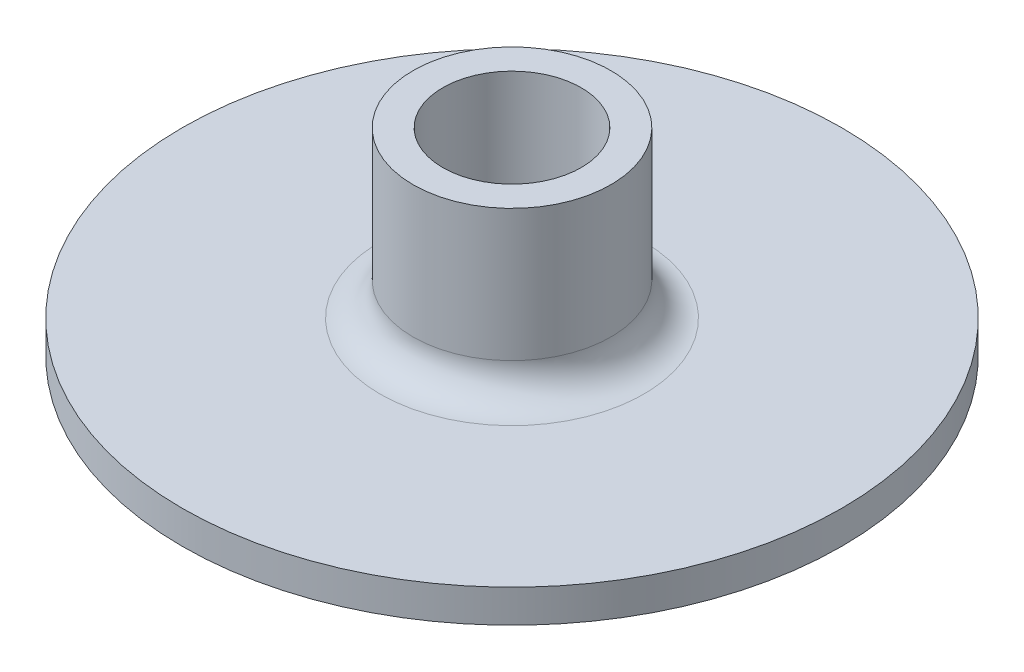
ISO-10303-21;
HEADER;
FILE_DESCRIPTION(('STEP AP214'),'2;1');
FILE_NAME('part.step','',(''),(''),'','','');
FILE_SCHEMA(('AUTOMOTIVE_DESIGN { 1 0 10303 214 1 1 1 1 }'));
ENDSEC;
DATA;
#1=APPLICATION_CONTEXT('core data for automotive mechanical design processes');
#2=APPLICATION_PROTOCOL_DEFINITION('international standard','automotive_design',2000,#1);
#3=PRODUCT_CONTEXT('',#1,'mechanical');
#4=PRODUCT('Part','Part','',(#3));
#5=PRODUCT_RELATED_PRODUCT_CATEGORY('part','',(#4));
#6=PRODUCT_DEFINITION_FORMATION('','',#4);
#7=PRODUCT_DEFINITION_CONTEXT('part definition',#1,'design');
#8=PRODUCT_DEFINITION('design','',#6,#7);
#9=PRODUCT_DEFINITION_SHAPE('','',#8);
#10=(LENGTH_UNIT() NAMED_UNIT(*) SI_UNIT(.MILLI.,.METRE.));
#11=(NAMED_UNIT(*) PLANE_ANGLE_UNIT() SI_UNIT($,.RADIAN.));
#12=(NAMED_UNIT(*) SI_UNIT($,.STERADIAN.) SOLID_ANGLE_UNIT());
#13=UNCERTAINTY_MEASURE_WITH_UNIT(LENGTH_MEASURE(1.E-05),#10,'distance_accuracy_value','');
#14=(GEOMETRIC_REPRESENTATION_CONTEXT(3) GLOBAL_UNCERTAINTY_ASSIGNED_CONTEXT((#13)) GLOBAL_UNIT_ASSIGNED_CONTEXT((#10,
#11,#12)) REPRESENTATION_CONTEXT('',''));
#15=CARTESIAN_POINT('',(0.,0.,0.));
#16=DIRECTION('',(0.,0.,1.));
#17=DIRECTION('',(1.,0.,0.));
#18=AXIS2_PLACEMENT_3D('',#15,#16,#17);
#19=CARTESIAN_POINT('',(0.,-9.,0.));
#20=DIRECTION('',(0.,1.,0.));
#21=DIRECTION('',(0.,0.,1.));
#22=AXIS2_PLACEMENT_3D('',#19,#20,#21);
#23=CYLINDRICAL_SURFACE('',#22,19.);
#24=CARTESIAN_POINT('',(0.,0.,0.));
#25=DIRECTION('',(0.,-1.,0.));
#26=DIRECTION('',(0.,0.,-1.));
#27=AXIS2_PLACEMENT_3D('',#24,#25,#26);
#28=CIRCLE('',#27,19.);
#29=CARTESIAN_POINT('',(0.,0.,-19.));
#30=VERTEX_POINT('',#29);
#31=EDGE_CURVE('E69',#30,#30,#28,.T.);
#32=ORIENTED_EDGE('',*,*,#31,.F.);
#33=EDGE_LOOP('',(#32));
#34=FACE_BOUND('',#33,.T.);
#35=CARTESIAN_POINT('',(0.,-6.,0.));
#36=DIRECTION('',(0.,-1.,0.));
#37=DIRECTION('',(0.,0.,-1.));
#38=AXIS2_PLACEMENT_3D('',#35,#36,#37);
#39=CIRCLE('',#38,19.);
#40=CARTESIAN_POINT('',(0.,-6.,-19.));
#41=VERTEX_POINT('',#40);
#42=EDGE_CURVE('E47',#41,#41,#39,.T.);
#43=ORIENTED_EDGE('',*,*,#42,.T.);
#44=EDGE_LOOP('',(#43));
#45=FACE_BOUND('',#44,.T.);
#46=ADVANCED_FACE('F29',(#34,#45),#23,.F.);
#47=CARTESIAN_POINT('',(0.,0.,0.));
#48=DIRECTION('',(0.,1.,0.));
#49=DIRECTION('',(0.,0.,1.));
#50=AXIS2_PLACEMENT_3D('',#47,#48,#49);
#51=PLANE('',#50);
#52=CARTESIAN_POINT('',(0.,0.,0.));
#53=DIRECTION('',(0.,1.,0.));
#54=DIRECTION('',(0.,0.,1.));
#55=AXIS2_PLACEMENT_3D('',#52,#53,#54);
#56=CIRCLE('',#55,50.);
#57=CARTESIAN_POINT('',(0.,0.,50.));
#58=VERTEX_POINT('',#57);
#59=EDGE_CURVE('E44',#58,#58,#56,.T.);
#60=ORIENTED_EDGE('',*,*,#59,.F.);
#61=EDGE_LOOP('',(#60));
#62=FACE_BOUND('',#61,.T.);
#63=CARTESIAN_POINT('',(0.,0.,0.));
#64=DIRECTION('',(0.,1.,0.));
#65=DIRECTION('',(0.,0.,1.));
#66=AXIS2_PLACEMENT_3D('',#63,#64,#65);
#67=CIRCLE('',#66,28.);
#68=CARTESIAN_POINT('',(0.,0.,28.));
#69=VERTEX_POINT('',#68);
#70=EDGE_CURVE('E40',#69,#69,#67,.F.);
#71=ORIENTED_EDGE('',*,*,#70,.F.);
#72=EDGE_LOOP('',(#71));
#73=FACE_BOUND('',#72,.T.);
#74=ADVANCED_FACE('F137',(#62,#73),#51,.F.);
#75=ORIENTED_EDGE('',*,*,#31,.T.);
#76=EDGE_LOOP('',(#75));
#77=FACE_BOUND('',#76,.T.);
#78=CARTESIAN_POINT('',(0.,0.,0.));
#79=DIRECTION('',(0.,1.,0.));
#80=DIRECTION('',(0.,0.,1.));
#81=AXIS2_PLACEMENT_3D('',#78,#79,#80);
#82=CIRCLE('',#81,10.5);
#83=CARTESIAN_POINT('',(0.,0.,10.5));
#84=VERTEX_POINT('',#83);
#85=EDGE_CURVE('E55',#84,#84,#82,.T.);
#86=ORIENTED_EDGE('',*,*,#85,.T.);
#87=EDGE_LOOP('',(#86));
#88=FACE_BOUND('',#87,.T.);
#89=ADVANCED_FACE('F143',(#77,#88),#51,.F.);
#90=CARTESIAN_POINT('',(0.,30.,0.));
#91=DIRECTION('',(0.,1.,0.));
#92=DIRECTION('',(0.,0.,1.));
#93=AXIS2_PLACEMENT_3D('',#90,#91,#92);
#94=PLANE('',#93);
#95=CARTESIAN_POINT('',(0.,30.,0.));
#96=DIRECTION('',(0.,1.,0.));
#97=DIRECTION('',(0.,0.,1.));
#98=AXIS2_PLACEMENT_3D('',#95,#96,#97);
#99=CIRCLE('',#98,10.5);
#100=CARTESIAN_POINT('',(0.,30.,10.5));
#101=VERTEX_POINT('',#100);
#102=EDGE_CURVE('E59',#101,#101,#99,.T.);
#103=ORIENTED_EDGE('',*,*,#102,.F.);
#104=EDGE_LOOP('',(#103));
#105=FACE_BOUND('',#104,.T.);
#106=CARTESIAN_POINT('',(0.,30.,0.));
#107=DIRECTION('',(0.,1.,0.));
#108=DIRECTION('',(0.,0.,1.));
#109=AXIS2_PLACEMENT_3D('',#106,#107,#108);
#110=CIRCLE('',#109,15.);
#111=CARTESIAN_POINT('',(0.,30.,15.));
#112=VERTEX_POINT('',#111);
#113=EDGE_CURVE('E56',#112,#112,#110,.T.);
#114=ORIENTED_EDGE('',*,*,#113,.T.);
#115=EDGE_LOOP('',(#114));
#116=FACE_BOUND('',#115,.T.);
#117=ADVANCED_FACE('F172',(#105,#116),#94,.T.);
#118=CARTESIAN_POINT('',(0.,30.,0.));
#119=DIRECTION('',(0.,-1.,0.));
#120=DIRECTION('',(0.,0.,-1.));
#121=AXIS2_PLACEMENT_3D('',#118,#119,#120);
#122=CYLINDRICAL_SURFACE('',#121,50.);
#123=ORIENTED_EDGE('',*,*,#59,.T.);
#124=EDGE_LOOP('',(#123));
#125=FACE_BOUND('',#124,.T.);
#126=CARTESIAN_POINT('',(0.,5.,0.));
#127=DIRECTION('',(0.,1.,0.));
#128=DIRECTION('',(0.,0.,1.));
#129=AXIS2_PLACEMENT_3D('',#126,#127,#128);
#130=CIRCLE('',#129,50.);
#131=CARTESIAN_POINT('',(0.,5.,50.));
#132=VERTEX_POINT('',#131);
#133=EDGE_CURVE('E52',#132,#132,#130,.T.);
#134=ORIENTED_EDGE('',*,*,#133,.F.);
#135=EDGE_LOOP('',(#134));
#136=FACE_BOUND('',#135,.T.);
#137=ADVANCED_FACE('F170',(#125,#136),#122,.T.);
#138=CARTESIAN_POINT('',(0.,30.,0.));
#139=DIRECTION('',(0.,-1.,0.));
#140=DIRECTION('',(0.,0.,-1.));
#141=AXIS2_PLACEMENT_3D('',#138,#139,#140);
#142=CYLINDRICAL_SURFACE('',#141,10.5);
#143=ORIENTED_EDGE('',*,*,#102,.T.);
#144=EDGE_LOOP('',(#143));
#145=FACE_BOUND('',#144,.T.);
#146=ORIENTED_EDGE('',*,*,#85,.F.);
#147=EDGE_LOOP('',(#146));
#148=FACE_BOUND('',#147,.T.);
#149=ADVANCED_FACE('F168',(#145,#148),#142,.F.);
#150=CARTESIAN_POINT('',(0.,5.,0.));
#151=DIRECTION('',(0.,1.,0.));
#152=DIRECTION('',(0.,0.,1.));
#153=AXIS2_PLACEMENT_3D('',#150,#151,#152);
#154=PLANE('',#153);
#155=CARTESIAN_POINT('',(0.,5.,0.));
#156=DIRECTION('',(0.,1.,0.));
#157=DIRECTION('',(0.,0.,1.));
#158=AXIS2_PLACEMENT_3D('',#155,#156,#157);
#159=CIRCLE('',#158,20.);
#160=CARTESIAN_POINT('',(0.,5.,20.));
#161=VERTEX_POINT('',#160);
#162=EDGE_CURVE('E10',#161,#161,#159,.F.);
#163=ORIENTED_EDGE('',*,*,#162,.T.);
#164=EDGE_LOOP('',(#163));
#165=FACE_BOUND('',#164,.T.);
#166=ORIENTED_EDGE('',*,*,#133,.T.);
#167=EDGE_LOOP('',(#166));
#168=FACE_BOUND('',#167,.T.);
#169=ADVANCED_FACE('F165',(#165,#168),#154,.T.);
#170=CARTESIAN_POINT('',(0.,5.,0.));
#171=DIRECTION('',(0.,1.,0.));
#172=DIRECTION('',(0.,0.,1.));
#173=AXIS2_PLACEMENT_3D('',#170,#171,#172);
#174=CYLINDRICAL_SURFACE('',#173,15.);
#175=CARTESIAN_POINT('',(0.,10.,0.));
#176=DIRECTION('',(0.,1.,0.));
#177=DIRECTION('',(0.,0.,1.));
#178=AXIS2_PLACEMENT_3D('',#175,#176,#177);
#179=CIRCLE('',#178,15.);
#180=CARTESIAN_POINT('',(0.,10.,15.));
#181=VERTEX_POINT('',#180);
#182=EDGE_CURVE('E36',#181,#181,#179,.T.);
#183=ORIENTED_EDGE('',*,*,#182,.T.);
#184=EDGE_LOOP('',(#183));
#185=FACE_BOUND('',#184,.T.);
#186=ORIENTED_EDGE('',*,*,#113,.F.);
#187=EDGE_LOOP('',(#186));
#188=FACE_BOUND('',#187,.T.);
#189=ADVANCED_FACE('F114',(#185,#188),#174,.T.);
#190=CARTESIAN_POINT('',(0.,-9.,0.));
#191=DIRECTION('',(0.,-1.,0.));
#192=DIRECTION('',(0.,0.,-1.));
#193=AXIS2_PLACEMENT_3D('',#190,#191,#192);
#194=PLANE('',#193);
#195=CARTESIAN_POINT('',(0.,-9.,0.));
#196=DIRECTION('',(0.,-1.,0.));
#197=DIRECTION('',(0.,0.,-1.));
#198=AXIS2_PLACEMENT_3D('',#195,#196,#197);
#199=CIRCLE('',#198,22.1);
#200=CARTESIAN_POINT('',(0.,-9.,-22.1));
#201=VERTEX_POINT('',#200);
#202=EDGE_CURVE('E95',#201,#201,#199,.T.);
#203=ORIENTED_EDGE('',*,*,#202,.F.);
#204=EDGE_LOOP('',(#203));
#205=FACE_BOUND('',#204,.T.);
#206=CARTESIAN_POINT('',(-1.74574168055469E-13,-9.,-25.));
#207=DIRECTION('',(0.,-1.,0.));
#208=DIRECTION('',(0.,0.,-1.));
#209=AXIS2_PLACEMENT_3D('',#206,#207,#208);
#210=CIRCLE('',#209,1.5);
#211=CARTESIAN_POINT('',(-1.74574168055469E-13,-9.,-26.5));
#212=VERTEX_POINT('',#211);
#213=EDGE_CURVE('E82',#212,#212,#210,.T.);
#214=ORIENTED_EDGE('',*,*,#213,.F.);
#215=EDGE_LOOP('',(#214));
#216=FACE_BOUND('',#215,.T.);
#217=CARTESIAN_POINT('',(0.,-9.,25.));
#218=DIRECTION('',(0.,-1.,0.));
#219=DIRECTION('',(0.,0.,-1.));
#220=AXIS2_PLACEMENT_3D('',#217,#218,#219);
#221=CIRCLE('',#220,1.5);
#222=CARTESIAN_POINT('',(0.,-9.,23.5));
#223=VERTEX_POINT('',#222);
#224=EDGE_CURVE('E72',#223,#223,#221,.T.);
#225=ORIENTED_EDGE('',*,*,#224,.F.);
#226=EDGE_LOOP('',(#225));
#227=FACE_BOUND('',#226,.T.);
#228=CARTESIAN_POINT('',(0.,-9.,0.));
#229=DIRECTION('',(0.,-1.,0.));
#230=DIRECTION('',(0.,0.,-1.));
#231=AXIS2_PLACEMENT_3D('',#228,#229,#230);
#232=CIRCLE('',#231,28.);
#233=CARTESIAN_POINT('',(0.,-9.,-28.));
#234=VERTEX_POINT('',#233);
#235=EDGE_CURVE('E66',#234,#234,#232,.T.);
#236=ORIENTED_EDGE('',*,*,#235,.T.);
#237=EDGE_LOOP('',(#236));
#238=FACE_BOUND('',#237,.T.);
#239=CARTESIAN_POINT('',(25.,-9.,0.));
#240=DIRECTION('',(0.,-1.,0.));
#241=DIRECTION('',(0.,0.,-1.));
#242=AXIS2_PLACEMENT_3D('',#239,#240,#241);
#243=CIRCLE('',#242,1.5);
#244=CARTESIAN_POINT('',(25.,-9.,-1.50000000000009));
#245=VERTEX_POINT('',#244);
#246=EDGE_CURVE('E76',#245,#245,#243,.T.);
#247=ORIENTED_EDGE('',*,*,#246,.F.);
#248=EDGE_LOOP('',(#247));
#249=FACE_BOUND('',#248,.T.);
#250=CARTESIAN_POINT('',(-25.,-9.,2.61861252083204E-13));
#251=DIRECTION('',(0.,-1.,0.));
#252=DIRECTION('',(0.,0.,-1.));
#253=AXIS2_PLACEMENT_3D('',#250,#251,#252);
#254=CIRCLE('',#253,1.5);
#255=CARTESIAN_POINT('',(-25.,-9.,-1.49999999999974));
#256=VERTEX_POINT('',#255);
#257=EDGE_CURVE('E88',#256,#256,#254,.T.);
#258=ORIENTED_EDGE('',*,*,#257,.F.);
#259=EDGE_LOOP('',(#258));
#260=FACE_BOUND('',#259,.T.);
#261=ADVANCED_FACE('F110',(#205,#216,#227,#238,#249,#260),#194,.T.);
#262=CARTESIAN_POINT('',(0.,-9.,0.));
#263=DIRECTION('',(0.,1.,0.));
#264=DIRECTION('',(0.,0.,1.));
#265=AXIS2_PLACEMENT_3D('',#262,#263,#264);
#266=CYLINDRICAL_SURFACE('',#265,28.);
#267=ORIENTED_EDGE('',*,*,#235,.F.);
#268=EDGE_LOOP('',(#267));
#269=FACE_BOUND('',#268,.T.);
#270=ORIENTED_EDGE('',*,*,#70,.T.);
#271=EDGE_LOOP('',(#270));
#272=FACE_BOUND('',#271,.T.);
#273=ADVANCED_FACE('F113',(#269,#272),#266,.T.);
#274=CARTESIAN_POINT('',(0.,-9.,25.));
#275=DIRECTION('',(0.,1.,0.));
#276=DIRECTION('',(0.,0.,1.));
#277=AXIS2_PLACEMENT_3D('',#274,#275,#276);
#278=CYLINDRICAL_SURFACE('',#277,1.5);
#279=ORIENTED_EDGE('',*,*,#224,.T.);
#280=EDGE_LOOP('',(#279));
#281=FACE_BOUND('',#280,.T.);
#282=CARTESIAN_POINT('',(0.,0.,25.));
#283=DIRECTION('',(0.,-1.,0.));
#284=DIRECTION('',(0.,0.,-1.));
#285=AXIS2_PLACEMENT_3D('',#282,#283,#284);
#286=CIRCLE('',#285,1.5);
#287=CARTESIAN_POINT('',(0.,0.,23.5));
#288=VERTEX_POINT('',#287);
#289=EDGE_CURVE('E73',#288,#288,#286,.T.);
#290=ORIENTED_EDGE('',*,*,#289,.F.);
#291=EDGE_LOOP('',(#290));
#292=FACE_BOUND('',#291,.T.);
#293=ADVANCED_FACE('F157',(#281,#292),#278,.F.);
#294=CARTESIAN_POINT('',(25.,-9.,0.));
#295=DIRECTION('',(0.,1.,0.));
#296=DIRECTION('',(0.,0.,1.));
#297=AXIS2_PLACEMENT_3D('',#294,#295,#296);
#298=CYLINDRICAL_SURFACE('',#297,1.5);
#299=ORIENTED_EDGE('',*,*,#246,.T.);
#300=EDGE_LOOP('',(#299));
#301=FACE_BOUND('',#300,.T.);
#302=CARTESIAN_POINT('',(25.,0.,0.));
#303=DIRECTION('',(0.,-1.,0.));
#304=DIRECTION('',(0.,0.,-1.));
#305=AXIS2_PLACEMENT_3D('',#302,#303,#304);
#306=CIRCLE('',#305,1.5);
#307=CARTESIAN_POINT('',(25.,0.,-1.50000000000009));
#308=VERTEX_POINT('',#307);
#309=EDGE_CURVE('E79',#308,#308,#306,.T.);
#310=ORIENTED_EDGE('',*,*,#309,.F.);
#311=EDGE_LOOP('',(#310));
#312=FACE_BOUND('',#311,.T.);
#313=ADVANCED_FACE('F238',(#301,#312),#298,.F.);
#314=CARTESIAN_POINT('',(-1.74574168055469E-13,-9.,-25.));
#315=DIRECTION('',(0.,1.,0.));
#316=DIRECTION('',(0.,0.,1.));
#317=AXIS2_PLACEMENT_3D('',#314,#315,#316);
#318=CYLINDRICAL_SURFACE('',#317,1.5);
#319=ORIENTED_EDGE('',*,*,#213,.T.);
#320=EDGE_LOOP('',(#319));
#321=FACE_BOUND('',#320,.T.);
#322=CARTESIAN_POINT('',(-1.74574168055469E-13,0.,-25.));
#323=DIRECTION('',(0.,-1.,0.));
#324=DIRECTION('',(0.,0.,-1.));
#325=AXIS2_PLACEMENT_3D('',#322,#323,#324);
#326=CIRCLE('',#325,1.5);
#327=CARTESIAN_POINT('',(-1.74574168055469E-13,0.,-26.5));
#328=VERTEX_POINT('',#327);
#329=EDGE_CURVE('E85',#328,#328,#326,.T.);
#330=ORIENTED_EDGE('',*,*,#329,.F.);
#331=EDGE_LOOP('',(#330));
#332=FACE_BOUND('',#331,.T.);
#333=ADVANCED_FACE('F130',(#321,#332),#318,.F.);
#334=CARTESIAN_POINT('',(-25.,-9.,2.61861252083204E-13));
#335=DIRECTION('',(0.,1.,0.));
#336=DIRECTION('',(0.,0.,1.));
#337=AXIS2_PLACEMENT_3D('',#334,#335,#336);
#338=CYLINDRICAL_SURFACE('',#337,1.5);
#339=ORIENTED_EDGE('',*,*,#257,.T.);
#340=EDGE_LOOP('',(#339));
#341=FACE_BOUND('',#340,.T.);
#342=CARTESIAN_POINT('',(-25.,0.,2.61861252083204E-13));
#343=DIRECTION('',(0.,-1.,0.));
#344=DIRECTION('',(0.,0.,-1.));
#345=AXIS2_PLACEMENT_3D('',#342,#343,#344);
#346=CIRCLE('',#345,1.5);
#347=CARTESIAN_POINT('',(-25.,0.,-1.49999999999974));
#348=VERTEX_POINT('',#347);
#349=EDGE_CURVE('E49',#348,#348,#346,.T.);
#350=ORIENTED_EDGE('',*,*,#349,.F.);
#351=EDGE_LOOP('',(#350));
#352=FACE_BOUND('',#351,.T.);
#353=ADVANCED_FACE('F126',(#341,#352),#338,.F.);
#354=ORIENTED_EDGE('',*,*,#329,.T.);
#355=EDGE_LOOP('',(#354));
#356=FACE_BOUND('',#355,.T.);
#357=ADVANCED_FACE('F129',(#356),#51,.F.);
#358=ORIENTED_EDGE('',*,*,#309,.T.);
#359=EDGE_LOOP('',(#358));
#360=FACE_BOUND('',#359,.T.);
#361=ADVANCED_FACE('F141',(#360),#51,.F.);
#362=ORIENTED_EDGE('',*,*,#289,.T.);
#363=EDGE_LOOP('',(#362));
#364=FACE_BOUND('',#363,.T.);
#365=ADVANCED_FACE('F135',(#364),#51,.F.);
#366=ORIENTED_EDGE('',*,*,#349,.T.);
#367=EDGE_LOOP('',(#366));
#368=FACE_BOUND('',#367,.T.);
#369=ADVANCED_FACE('F106',(#368),#51,.F.);
#370=CARTESIAN_POINT('',(0.,-6.,0.));
#371=DIRECTION('',(0.,-1.,0.));
#372=DIRECTION('',(0.,0.,-1.));
#373=AXIS2_PLACEMENT_3D('',#370,#371,#372);
#374=CYLINDRICAL_SURFACE('',#373,22.1);
#375=CARTESIAN_POINT('',(0.,-6.,0.));
#376=DIRECTION('',(0.,-1.,0.));
#377=DIRECTION('',(0.,0.,-1.));
#378=AXIS2_PLACEMENT_3D('',#375,#376,#377);
#379=CIRCLE('',#378,22.1);
#380=CARTESIAN_POINT('',(0.,-6.,-22.1));
#381=VERTEX_POINT('',#380);
#382=EDGE_CURVE('E50',#381,#381,#379,.T.);
#383=ORIENTED_EDGE('',*,*,#382,.F.);
#384=EDGE_LOOP('',(#383));
#385=FACE_BOUND('',#384,.T.);
#386=ORIENTED_EDGE('',*,*,#202,.T.);
#387=EDGE_LOOP('',(#386));
#388=FACE_BOUND('',#387,.T.);
#389=ADVANCED_FACE('F103',(#385,#388),#374,.F.);
#390=CARTESIAN_POINT('',(0.,-6.,0.));
#391=DIRECTION('',(0.,-1.,0.));
#392=DIRECTION('',(0.,0.,-1.));
#393=AXIS2_PLACEMENT_3D('',#390,#391,#392);
#394=PLANE('',#393);
#395=ORIENTED_EDGE('',*,*,#42,.F.);
#396=EDGE_LOOP('',(#395));
#397=FACE_BOUND('',#396,.T.);
#398=ORIENTED_EDGE('',*,*,#382,.T.);
#399=EDGE_LOOP('',(#398));
#400=FACE_BOUND('',#399,.T.);
#401=ADVANCED_FACE('F101',(#397,#400),#394,.T.);
#402=CARTESIAN_POINT('',(0.,10.,0.));
#403=DIRECTION('',(0.,1.,0.));
#404=DIRECTION('',(0.,0.,1.));
#405=AXIS2_PLACEMENT_3D('',#402,#403,#404);
#406=TOROIDAL_SURFACE('',#405,20.,5.);
#407=ORIENTED_EDGE('',*,*,#162,.F.);
#408=EDGE_LOOP('',(#407));
#409=FACE_BOUND('',#408,.T.);
#410=ORIENTED_EDGE('',*,*,#182,.F.);
#411=EDGE_LOOP('',(#410));
#412=FACE_BOUND('',#411,.T.);
#413=ADVANCED_FACE('F31',(#409,#412),#406,.F.);
#414=CLOSED_SHELL('',(#46,#74,#89,#117,#137,#149,#169,#189,#261,#273,#293,#313,#333,#353,#357,
#361,#365,#369,#389,#401,#413));
#415=MANIFOLD_SOLID_BREP('B2',#414);
#416=ADVANCED_BREP_SHAPE_REPRESENTATION('',(#18,#415),#14);
#417=SHAPE_DEFINITION_REPRESENTATION(#9,#416);
ENDSEC;
END-ISO-10303-21;
